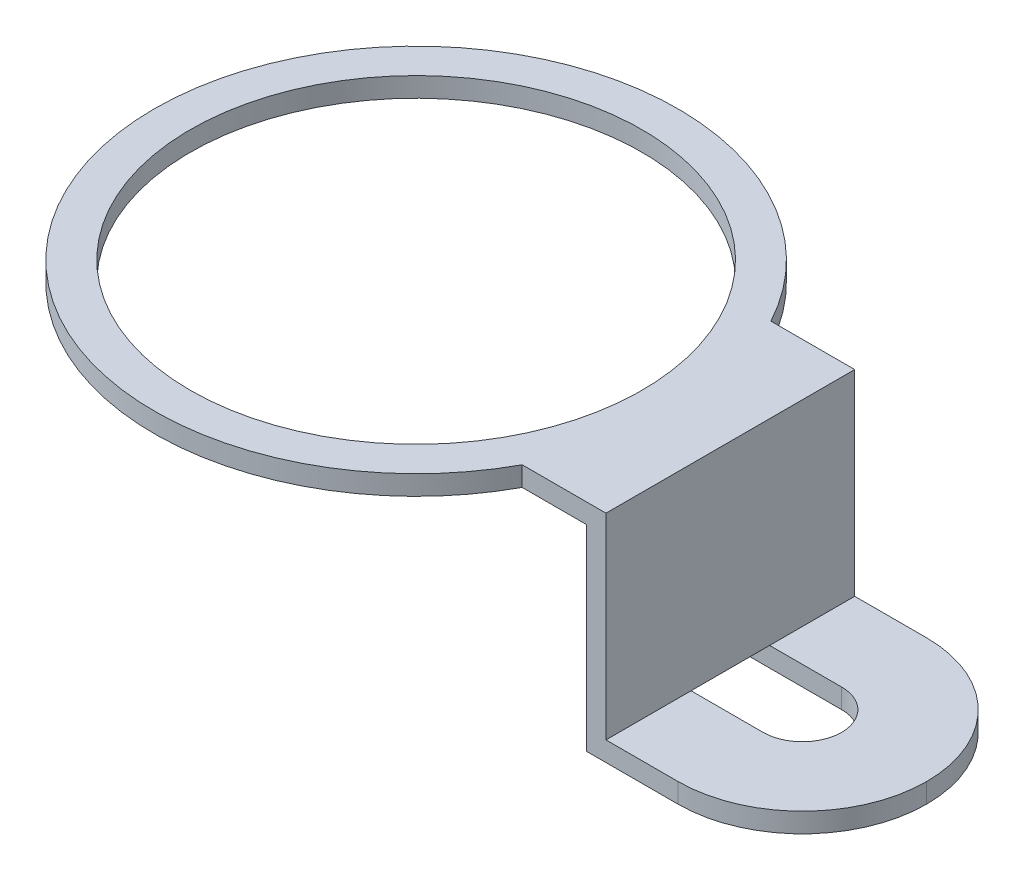
ISO-10303-21;
HEADER;
FILE_DESCRIPTION(('STEP AP214'),'2;1');
FILE_NAME('part.step','',(''),(''),'','','');
FILE_SCHEMA(('AUTOMOTIVE_DESIGN { 1 0 10303 214 1 1 1 1 }'));
ENDSEC;
DATA;
#1=APPLICATION_CONTEXT('core data for automotive mechanical design processes');
#2=APPLICATION_PROTOCOL_DEFINITION('international standard','automotive_design',2000,#1);
#3=PRODUCT_CONTEXT('',#1,'mechanical');
#4=PRODUCT('Part','Part','',(#3));
#5=PRODUCT_RELATED_PRODUCT_CATEGORY('part','',(#4));
#6=PRODUCT_DEFINITION_FORMATION('','',#4);
#7=PRODUCT_DEFINITION_CONTEXT('part definition',#1,'design');
#8=PRODUCT_DEFINITION('design','',#6,#7);
#9=PRODUCT_DEFINITION_SHAPE('','',#8);
#10=(LENGTH_UNIT() NAMED_UNIT(*) SI_UNIT(.MILLI.,.METRE.));
#11=(NAMED_UNIT(*) PLANE_ANGLE_UNIT() SI_UNIT($,.RADIAN.));
#12=(NAMED_UNIT(*) SI_UNIT($,.STERADIAN.) SOLID_ANGLE_UNIT());
#13=UNCERTAINTY_MEASURE_WITH_UNIT(LENGTH_MEASURE(1.E-05),#10,'distance_accuracy_value','');
#14=(GEOMETRIC_REPRESENTATION_CONTEXT(3) GLOBAL_UNCERTAINTY_ASSIGNED_CONTEXT((#13)) GLOBAL_UNIT_ASSIGNED_CONTEXT((#10,
#11,#12)) REPRESENTATION_CONTEXT('',''));
#15=CARTESIAN_POINT('',(0.,0.,0.));
#16=DIRECTION('',(0.,0.,1.));
#17=DIRECTION('',(1.,0.,0.));
#18=AXIS2_PLACEMENT_3D('',#15,#16,#17);
#19=CARTESIAN_POINT('',(10.,0.3,0.));
#20=DIRECTION('',(0.,-1.,0.));
#21=DIRECTION('',(0.,0.,-1.));
#22=AXIS2_PLACEMENT_3D('',#19,#20,#21);
#23=PLANE('',#22);
#24=CARTESIAN_POINT('',(0.,0.3,0.));
#25=DIRECTION('',(0.,1.,0.));
#26=DIRECTION('',(0.,0.,1.));
#27=AXIS2_PLACEMENT_3D('',#24,#25,#26);
#28=CIRCLE('',#27,3.45);
#29=CARTESIAN_POINT('',(0.,0.3,3.45));
#30=VERTEX_POINT('',#29);
#31=EDGE_CURVE('E187',#30,#30,#28,.T.);
#32=ORIENTED_EDGE('',*,*,#31,.F.);
#33=EDGE_LOOP('',(#32));
#34=FACE_BOUND('',#33,.T.);
#35=DIRECTION('',(1.,0.,0.));
#36=VECTOR('',#35,1.);
#37=CARTESIAN_POINT('',(3.51994318135961,0.3,1.9));
#38=LINE('',#37,#36);
#39=CARTESIAN_POINT('',(3.51994318135961,0.3,1.9));
#40=VERTEX_POINT('',#39);
#41=CARTESIAN_POINT('',(4.8,0.3,1.9));
#42=VERTEX_POINT('',#41);
#43=EDGE_CURVE('E290',#40,#42,#38,.T.);
#44=ORIENTED_EDGE('',*,*,#43,.T.);
#45=DIRECTION('',(0.,0.,1.));
#46=VECTOR('',#45,1.);
#47=CARTESIAN_POINT('',(4.8,0.3,-6.56690475583121));
#48=LINE('',#47,#46);
#49=CARTESIAN_POINT('',(4.8,0.3,-1.9));
#50=VERTEX_POINT('',#49);
#51=EDGE_CURVE('E169',#50,#42,#48,.T.);
#52=ORIENTED_EDGE('',*,*,#51,.F.);
#53=DIRECTION('',(-1.,0.,0.));
#54=VECTOR('',#53,1.);
#55=CARTESIAN_POINT('',(3.51994318135961,0.3,-1.9));
#56=LINE('',#55,#54);
#57=CARTESIAN_POINT('',(3.51994318135961,0.3,-1.9));
#58=VERTEX_POINT('',#57);
#59=EDGE_CURVE('E200',#50,#58,#56,.T.);
#60=ORIENTED_EDGE('',*,*,#59,.T.);
#61=CARTESIAN_POINT('',(0.,0.3,0.));
#62=DIRECTION('',(0.,1.,0.));
#63=DIRECTION('',(0.,0.,-1.));
#64=AXIS2_PLACEMENT_3D('',#61,#62,#63);
#65=CIRCLE('',#64,4.);
#66=EDGE_CURVE('E295',#58,#40,#65,.T.);
#67=ORIENTED_EDGE('',*,*,#66,.T.);
#68=EDGE_LOOP('',(#44,#52,#60,#67));
#69=FACE_BOUND('',#68,.T.);
#70=ADVANCED_FACE('F35',(#34,#69),#23,.F.);
#71=CARTESIAN_POINT('',(10.,0.,0.));
#72=DIRECTION('',(0.,-1.,0.));
#73=DIRECTION('',(0.,0.,-1.));
#74=AXIS2_PLACEMENT_3D('',#71,#72,#73);
#75=PLANE('',#74);
#76=DIRECTION('',(0.,0.,-1.));
#77=VECTOR('',#76,1.);
#78=CARTESIAN_POINT('',(4.5,0.,0.));
#79=LINE('',#78,#77);
#80=CARTESIAN_POINT('',(4.5,0.,1.9));
#81=VERTEX_POINT('',#80);
#82=CARTESIAN_POINT('',(4.5,0.,-1.9));
#83=VERTEX_POINT('',#82);
#84=EDGE_CURVE('E190',#81,#83,#79,.T.);
#85=ORIENTED_EDGE('',*,*,#84,.F.);
#86=DIRECTION('',(1.,0.,0.));
#87=VECTOR('',#86,1.);
#88=CARTESIAN_POINT('',(3.51994318135961,0.,1.9));
#89=LINE('',#88,#87);
#90=CARTESIAN_POINT('',(3.51994318135961,0.,1.9));
#91=VERTEX_POINT('',#90);
#92=EDGE_CURVE('E197',#91,#81,#89,.T.);
#93=ORIENTED_EDGE('',*,*,#92,.F.);
#94=CARTESIAN_POINT('',(0.,0.,0.));
#95=DIRECTION('',(0.,1.,0.));
#96=DIRECTION('',(0.,0.,-1.));
#97=AXIS2_PLACEMENT_3D('',#94,#95,#96);
#98=CIRCLE('',#97,4.);
#99=CARTESIAN_POINT('',(3.51994318135961,0.,-1.9));
#100=VERTEX_POINT('',#99);
#101=EDGE_CURVE('E201',#100,#91,#98,.T.);
#102=ORIENTED_EDGE('',*,*,#101,.F.);
#103=DIRECTION('',(-1.,0.,0.));
#104=VECTOR('',#103,1.);
#105=CARTESIAN_POINT('',(3.51994318135961,0.,-1.9));
#106=LINE('',#105,#104);
#107=EDGE_CURVE('E280',#83,#100,#106,.T.);
#108=ORIENTED_EDGE('',*,*,#107,.F.);
#109=EDGE_LOOP('',(#85,#93,#102,#108));
#110=FACE_BOUND('',#109,.T.);
#111=CARTESIAN_POINT('',(0.,0.,0.));
#112=DIRECTION('',(0.,1.,0.));
#113=DIRECTION('',(0.,0.,1.));
#114=AXIS2_PLACEMENT_3D('',#111,#112,#113);
#115=CIRCLE('',#114,3.45);
#116=CARTESIAN_POINT('',(0.,0.,3.45));
#117=VERTEX_POINT('',#116);
#118=EDGE_CURVE('E194',#117,#117,#115,.T.);
#119=ORIENTED_EDGE('',*,*,#118,.T.);
#120=EDGE_LOOP('',(#119));
#121=FACE_BOUND('',#120,.T.);
#122=ADVANCED_FACE('F284',(#110,#121),#75,.T.);
#123=CARTESIAN_POINT('',(3.51994318135961,0.3,-1.9));
#124=DIRECTION('',(0.,0.,1.));
#125=DIRECTION('',(1.,0.,0.));
#126=AXIS2_PLACEMENT_3D('',#123,#124,#125);
#127=PLANE('',#126);
#128=DIRECTION('',(1.,0.,0.));
#129=VECTOR('',#128,1.);
#130=CARTESIAN_POINT('',(4.8,-2.7,-1.9));
#131=LINE('',#130,#129);
#132=CARTESIAN_POINT('',(4.8,-2.7,-1.9));
#133=VERTEX_POINT('',#132);
#134=CARTESIAN_POINT('',(5.9,-2.7,-1.9));
#135=VERTEX_POINT('',#134);
#136=EDGE_CURVE('E168',#133,#135,#131,.T.);
#137=ORIENTED_EDGE('',*,*,#136,.T.);
#138=DIRECTION('',(0.,-1.,0.));
#139=VECTOR('',#138,1.);
#140=CARTESIAN_POINT('',(5.9,-3.,-1.9));
#141=LINE('',#140,#139);
#142=CARTESIAN_POINT('',(5.9,-3.,-1.9));
#143=VERTEX_POINT('',#142);
#144=EDGE_CURVE('E204',#135,#143,#141,.T.);
#145=ORIENTED_EDGE('',*,*,#144,.T.);
#146=DIRECTION('',(-1.,0.,0.));
#147=VECTOR('',#146,1.);
#148=CARTESIAN_POINT('',(4.5,-3.,-1.9));
#149=LINE('',#148,#147);
#150=CARTESIAN_POINT('',(4.5,-3.,-1.9));
#151=VERTEX_POINT('',#150);
#152=EDGE_CURVE('E166',#143,#151,#149,.T.);
#153=ORIENTED_EDGE('',*,*,#152,.T.);
#154=DIRECTION('',(0.,1.,0.));
#155=VECTOR('',#154,1.);
#156=CARTESIAN_POINT('',(4.5,0.,-1.9));
#157=LINE('',#156,#155);
#158=EDGE_CURVE('E174',#151,#83,#157,.T.);
#159=ORIENTED_EDGE('',*,*,#158,.T.);
#160=ORIENTED_EDGE('',*,*,#107,.T.);
#161=DIRECTION('',(0.,-1.,0.));
#162=VECTOR('',#161,1.);
#163=CARTESIAN_POINT('',(3.51994318135961,0.3,-1.9));
#164=LINE('',#163,#162);
#165=EDGE_CURVE('E208',#58,#100,#164,.T.);
#166=ORIENTED_EDGE('',*,*,#165,.F.);
#167=ORIENTED_EDGE('',*,*,#59,.F.);
#168=DIRECTION('',(0.,-1.,0.));
#169=VECTOR('',#168,1.);
#170=CARTESIAN_POINT('',(4.8,0.3,-1.9));
#171=LINE('',#170,#169);
#172=EDGE_CURVE('E172',#50,#133,#171,.T.);
#173=ORIENTED_EDGE('',*,*,#172,.T.);
#174=EDGE_LOOP('',(#137,#145,#153,#159,#160,#166,#167,#173));
#175=FACE_BOUND('',#174,.T.);
#176=ADVANCED_FACE('F274',(#175),#127,.F.);
#177=CARTESIAN_POINT('',(0.,0.3,0.));
#178=DIRECTION('',(0.,-1.,0.));
#179=DIRECTION('',(0.,0.,-1.));
#180=AXIS2_PLACEMENT_3D('',#177,#178,#179);
#181=CYLINDRICAL_SURFACE('',#180,4.);
#182=ORIENTED_EDGE('',*,*,#101,.T.);
#183=DIRECTION('',(0.,-1.,0.));
#184=VECTOR('',#183,1.);
#185=CARTESIAN_POINT('',(3.51994318135961,0.3,1.9));
#186=LINE('',#185,#184);
#187=EDGE_CURVE('E289',#40,#91,#186,.T.);
#188=ORIENTED_EDGE('',*,*,#187,.F.);
#189=ORIENTED_EDGE('',*,*,#66,.F.);
#190=ORIENTED_EDGE('',*,*,#165,.T.);
#191=EDGE_LOOP('',(#182,#188,#189,#190));
#192=FACE_BOUND('',#191,.T.);
#193=ADVANCED_FACE('F307',(#192),#181,.T.);
#194=CARTESIAN_POINT('',(3.51994318135961,0.3,1.9));
#195=DIRECTION('',(0.,0.,-1.));
#196=DIRECTION('',(-1.,0.,0.));
#197=AXIS2_PLACEMENT_3D('',#194,#195,#196);
#198=PLANE('',#197);
#199=DIRECTION('',(1.,0.,0.));
#200=VECTOR('',#199,1.);
#201=CARTESIAN_POINT('',(4.5,-3.,1.9));
#202=LINE('',#201,#200);
#203=CARTESIAN_POINT('',(4.5,-3.,1.9));
#204=VERTEX_POINT('',#203);
#205=CARTESIAN_POINT('',(5.9,-3.,1.9));
#206=VERTEX_POINT('',#205);
#207=EDGE_CURVE('E177',#204,#206,#202,.T.);
#208=ORIENTED_EDGE('',*,*,#207,.T.);
#209=DIRECTION('',(0.,1.,0.));
#210=VECTOR('',#209,1.);
#211=CARTESIAN_POINT('',(5.9,-2.7,1.9));
#212=LINE('',#211,#210);
#213=CARTESIAN_POINT('',(5.9,-2.7,1.9));
#214=VERTEX_POINT('',#213);
#215=EDGE_CURVE('E216',#206,#214,#212,.T.);
#216=ORIENTED_EDGE('',*,*,#215,.T.);
#217=DIRECTION('',(-1.,0.,0.));
#218=VECTOR('',#217,1.);
#219=CARTESIAN_POINT('',(4.8,-2.7,1.9));
#220=LINE('',#219,#218);
#221=CARTESIAN_POINT('',(4.8,-2.7,1.9));
#222=VERTEX_POINT('',#221);
#223=EDGE_CURVE('E256',#214,#222,#220,.T.);
#224=ORIENTED_EDGE('',*,*,#223,.T.);
#225=DIRECTION('',(0.,1.,0.));
#226=VECTOR('',#225,1.);
#227=CARTESIAN_POINT('',(4.8,0.3,1.9));
#228=LINE('',#227,#226);
#229=EDGE_CURVE('E253',#222,#42,#228,.T.);
#230=ORIENTED_EDGE('',*,*,#229,.T.);
#231=ORIENTED_EDGE('',*,*,#43,.F.);
#232=ORIENTED_EDGE('',*,*,#187,.T.);
#233=ORIENTED_EDGE('',*,*,#92,.T.);
#234=DIRECTION('',(0.,-1.,0.));
#235=VECTOR('',#234,1.);
#236=CARTESIAN_POINT('',(4.5,0.,1.9));
#237=LINE('',#236,#235);
#238=EDGE_CURVE('E180',#81,#204,#237,.T.);
#239=ORIENTED_EDGE('',*,*,#238,.T.);
#240=EDGE_LOOP('',(#208,#216,#224,#230,#231,#232,#233,#239));
#241=FACE_BOUND('',#240,.T.);
#242=ADVANCED_FACE('F264',(#241),#198,.F.);
#243=CARTESIAN_POINT('',(0.,0.3,0.));
#244=DIRECTION('',(0.,-1.,0.));
#245=DIRECTION('',(0.,0.,-1.));
#246=AXIS2_PLACEMENT_3D('',#243,#244,#245);
#247=CYLINDRICAL_SURFACE('',#246,3.45);
#248=ORIENTED_EDGE('',*,*,#31,.T.);
#249=EDGE_LOOP('',(#248));
#250=FACE_BOUND('',#249,.T.);
#251=ORIENTED_EDGE('',*,*,#118,.F.);
#252=EDGE_LOOP('',(#251));
#253=FACE_BOUND('',#252,.T.);
#254=ADVANCED_FACE('F315',(#250,#253),#247,.F.);
#255=CARTESIAN_POINT('',(4.8,0.3,-6.56690475583121));
#256=DIRECTION('',(1.,0.,0.));
#257=DIRECTION('',(0.,0.,-1.));
#258=AXIS2_PLACEMENT_3D('',#255,#256,#257);
#259=PLANE('',#258);
#260=ORIENTED_EDGE('',*,*,#172,.F.);
#261=ORIENTED_EDGE('',*,*,#51,.T.);
#262=ORIENTED_EDGE('',*,*,#229,.F.);
#263=DIRECTION('',(0.,0.,1.));
#264=VECTOR('',#263,1.);
#265=CARTESIAN_POINT('',(4.8,-2.7,-6.56690475583121));
#266=LINE('',#265,#264);
#267=CARTESIAN_POINT('',(4.8,-2.7,0.6));
#268=VERTEX_POINT('',#267);
#269=EDGE_CURVE('E241',#268,#222,#266,.T.);
#270=ORIENTED_EDGE('',*,*,#269,.F.);
#271=DIRECTION('',(0.,0.,1.));
#272=VECTOR('',#271,1.);
#273=CARTESIAN_POINT('',(4.8,-2.7,-6.56690475583121));
#274=LINE('',#273,#272);
#275=CARTESIAN_POINT('',(4.8,-2.7,-0.6));
#276=VERTEX_POINT('',#275);
#277=EDGE_CURVE('E140',#276,#268,#274,.T.);
#278=ORIENTED_EDGE('',*,*,#277,.F.);
#279=EDGE_CURVE('E239',#133,#276,#266,.T.);
#280=ORIENTED_EDGE('',*,*,#279,.F.);
#281=EDGE_LOOP('',(#260,#261,#262,#270,#278,#280));
#282=FACE_BOUND('',#281,.T.);
#283=ADVANCED_FACE('F238',(#282),#259,.T.);
#284=CARTESIAN_POINT('',(4.8,-2.7,-6.56690475583121));
#285=DIRECTION('',(0.,1.,0.));
#286=DIRECTION('',(-1.,0.,0.));
#287=AXIS2_PLACEMENT_3D('',#284,#285,#286);
#288=PLANE('',#287);
#289=DIRECTION('',(1.,0.,0.));
#290=VECTOR('',#289,1.);
#291=CARTESIAN_POINT('',(5.9,-2.7,0.6));
#292=LINE('',#291,#290);
#293=CARTESIAN_POINT('',(5.9,-2.7,0.6));
#294=VERTEX_POINT('',#293);
#295=EDGE_CURVE('E144',#268,#294,#292,.T.);
#296=ORIENTED_EDGE('',*,*,#295,.F.);
#297=ORIENTED_EDGE('',*,*,#269,.T.);
#298=ORIENTED_EDGE('',*,*,#223,.F.);
#299=CARTESIAN_POINT('',(5.9,-2.7,0.));
#300=DIRECTION('',(0.,1.,0.));
#301=DIRECTION('',(-1.,0.,0.));
#302=AXIS2_PLACEMENT_3D('',#299,#300,#301);
#303=CIRCLE('',#302,1.9);
#304=CARTESIAN_POINT('',(7.8,-2.7,0.));
#305=VERTEX_POINT('',#304);
#306=EDGE_CURVE('E212',#214,#305,#303,.T.);
#307=ORIENTED_EDGE('',*,*,#306,.T.);
#308=CARTESIAN_POINT('',(5.9,-2.7,0.));
#309=DIRECTION('',(0.,1.,0.));
#310=DIRECTION('',(-1.,0.,0.));
#311=AXIS2_PLACEMENT_3D('',#308,#309,#310);
#312=CIRCLE('',#311,1.9);
#313=EDGE_CURVE('E214',#305,#135,#312,.T.);
#314=ORIENTED_EDGE('',*,*,#313,.T.);
#315=ORIENTED_EDGE('',*,*,#136,.F.);
#316=ORIENTED_EDGE('',*,*,#279,.T.);
#317=DIRECTION('',(-1.,0.,0.));
#318=VECTOR('',#317,1.);
#319=CARTESIAN_POINT('',(5.9,-2.7,-0.6));
#320=LINE('',#319,#318);
#321=CARTESIAN_POINT('',(5.9,-2.7,-0.6));
#322=VERTEX_POINT('',#321);
#323=EDGE_CURVE('E148',#322,#276,#320,.T.);
#324=ORIENTED_EDGE('',*,*,#323,.F.);
#325=CARTESIAN_POINT('',(5.9,-2.7,0.));
#326=DIRECTION('',(0.,1.,0.));
#327=DIRECTION('',(-1.,0.,0.));
#328=AXIS2_PLACEMENT_3D('',#325,#326,#327);
#329=CIRCLE('',#328,0.6);
#330=EDGE_CURVE('E50',#294,#322,#329,.T.);
#331=ORIENTED_EDGE('',*,*,#330,.F.);
#332=EDGE_LOOP('',(#296,#297,#298,#307,#314,#315,#316,#324,#331));
#333=FACE_BOUND('',#332,.T.);
#334=ADVANCED_FACE('F151',(#333),#288,.T.);
#335=CARTESIAN_POINT('',(4.5,-3.,-6.56690475583121));
#336=DIRECTION('',(0.,-1.,0.));
#337=DIRECTION('',(0.,0.,-1.));
#338=AXIS2_PLACEMENT_3D('',#335,#336,#337);
#339=PLANE('',#338);
#340=DIRECTION('',(-1.,0.,0.));
#341=VECTOR('',#340,1.);
#342=CARTESIAN_POINT('',(4.5,-3.,0.6));
#343=LINE('',#342,#341);
#344=CARTESIAN_POINT('',(5.9,-3.,0.6));
#345=VERTEX_POINT('',#344);
#346=CARTESIAN_POINT('',(4.5,-3.,0.6));
#347=VERTEX_POINT('',#346);
#348=EDGE_CURVE('E163',#345,#347,#343,.T.);
#349=ORIENTED_EDGE('',*,*,#348,.F.);
#350=CARTESIAN_POINT('',(5.9,-3.,0.));
#351=DIRECTION('',(0.,-1.,0.));
#352=DIRECTION('',(0.,0.,-1.));
#353=AXIS2_PLACEMENT_3D('',#350,#351,#352);
#354=CIRCLE('',#353,0.6);
#355=CARTESIAN_POINT('',(5.9,-3.,-0.6));
#356=VERTEX_POINT('',#355);
#357=EDGE_CURVE('E11',#356,#345,#354,.T.);
#358=ORIENTED_EDGE('',*,*,#357,.F.);
#359=DIRECTION('',(1.,0.,0.));
#360=VECTOR('',#359,1.);
#361=CARTESIAN_POINT('',(4.5,-3.,-0.6));
#362=LINE('',#361,#360);
#363=CARTESIAN_POINT('',(4.5,-3.,-0.6));
#364=VERTEX_POINT('',#363);
#365=EDGE_CURVE('E161',#364,#356,#362,.T.);
#366=ORIENTED_EDGE('',*,*,#365,.F.);
#367=DIRECTION('',(0.,0.,1.));
#368=VECTOR('',#367,1.);
#369=CARTESIAN_POINT('',(4.5,-3.,-6.56690475583121));
#370=LINE('',#369,#368);
#371=EDGE_CURVE('E246',#151,#364,#370,.T.);
#372=ORIENTED_EDGE('',*,*,#371,.F.);
#373=ORIENTED_EDGE('',*,*,#152,.F.);
#374=CARTESIAN_POINT('',(5.9,-3.,0.));
#375=DIRECTION('',(0.,-1.,0.));
#376=DIRECTION('',(0.,0.,-1.));
#377=AXIS2_PLACEMENT_3D('',#374,#375,#376);
#378=CIRCLE('',#377,1.9);
#379=CARTESIAN_POINT('',(7.8,-3.,0.));
#380=VERTEX_POINT('',#379);
#381=EDGE_CURVE('E210',#143,#380,#378,.T.);
#382=ORIENTED_EDGE('',*,*,#381,.T.);
#383=CARTESIAN_POINT('',(5.9,-3.,0.));
#384=DIRECTION('',(0.,-1.,0.));
#385=DIRECTION('',(0.,0.,-1.));
#386=AXIS2_PLACEMENT_3D('',#383,#384,#385);
#387=CIRCLE('',#386,1.9);
#388=EDGE_CURVE('E207',#380,#206,#387,.T.);
#389=ORIENTED_EDGE('',*,*,#388,.T.);
#390=ORIENTED_EDGE('',*,*,#207,.F.);
#391=EDGE_CURVE('E249',#347,#204,#370,.T.);
#392=ORIENTED_EDGE('',*,*,#391,.F.);
#393=EDGE_LOOP('',(#349,#358,#366,#372,#373,#382,#389,#390,#392));
#394=FACE_BOUND('',#393,.T.);
#395=ADVANCED_FACE('F277',(#394),#339,.T.);
#396=CARTESIAN_POINT('',(4.5,0.,-6.56690475583121));
#397=DIRECTION('',(-1.,0.,0.));
#398=DIRECTION('',(0.,-1.,0.));
#399=AXIS2_PLACEMENT_3D('',#396,#397,#398);
#400=PLANE('',#399);
#401=DIRECTION('',(0.,1.,0.));
#402=VECTOR('',#401,1.);
#403=CARTESIAN_POINT('',(4.5,0.,0.6));
#404=LINE('',#403,#402);
#405=CARTESIAN_POINT('',(4.5,-2.7,0.600000000000001));
#406=VERTEX_POINT('',#405);
#407=EDGE_CURVE('E43',#347,#406,#404,.T.);
#408=ORIENTED_EDGE('',*,*,#407,.F.);
#409=ORIENTED_EDGE('',*,*,#391,.T.);
#410=ORIENTED_EDGE('',*,*,#238,.F.);
#411=ORIENTED_EDGE('',*,*,#84,.T.);
#412=ORIENTED_EDGE('',*,*,#158,.F.);
#413=ORIENTED_EDGE('',*,*,#371,.T.);
#414=DIRECTION('',(0.,-1.,0.));
#415=VECTOR('',#414,1.);
#416=CARTESIAN_POINT('',(4.5,0.,-0.6));
#417=LINE('',#416,#415);
#418=CARTESIAN_POINT('',(4.5,-2.7,-0.6));
#419=VERTEX_POINT('',#418);
#420=EDGE_CURVE('E222',#419,#364,#417,.T.);
#421=ORIENTED_EDGE('',*,*,#420,.F.);
#422=DIRECTION('',(0.,0.,-1.));
#423=VECTOR('',#422,1.);
#424=CARTESIAN_POINT('',(4.5,-2.7,-6.56690475583121));
#425=LINE('',#424,#423);
#426=EDGE_CURVE('E218',#406,#419,#425,.T.);
#427=ORIENTED_EDGE('',*,*,#426,.F.);
#428=EDGE_LOOP('',(#408,#409,#410,#411,#412,#413,#421,#427));
#429=FACE_BOUND('',#428,.T.);
#430=ADVANCED_FACE('F228',(#429),#400,.T.);
#431=CARTESIAN_POINT('',(5.9,0.3,0.));
#432=DIRECTION('',(0.,-1.,0.));
#433=DIRECTION('',(0.,0.,-1.));
#434=AXIS2_PLACEMENT_3D('',#431,#432,#433);
#435=CYLINDRICAL_SURFACE('',#434,1.9);
#436=DIRECTION('',(0.,1.,0.));
#437=VECTOR('',#436,1.);
#438=CARTESIAN_POINT('',(7.8,-3.,0.));
#439=LINE('',#438,#437);
#440=EDGE_CURVE('E165',#305,#380,#439,.F.);
#441=ORIENTED_EDGE('',*,*,#440,.F.);
#442=ORIENTED_EDGE('',*,*,#306,.F.);
#443=ORIENTED_EDGE('',*,*,#215,.F.);
#444=ORIENTED_EDGE('',*,*,#388,.F.);
#445=EDGE_LOOP('',(#441,#442,#443,#444));
#446=FACE_BOUND('',#445,.T.);
#447=ADVANCED_FACE('F37',(#446),#435,.T.);
#448=CARTESIAN_POINT('',(5.9,0.3,0.));
#449=DIRECTION('',(0.,1.,0.));
#450=DIRECTION('',(0.,0.,1.));
#451=AXIS2_PLACEMENT_3D('',#448,#449,#450);
#452=CYLINDRICAL_SURFACE('',#451,1.9);
#453=ORIENTED_EDGE('',*,*,#313,.F.);
#454=ORIENTED_EDGE('',*,*,#440,.T.);
#455=ORIENTED_EDGE('',*,*,#381,.F.);
#456=ORIENTED_EDGE('',*,*,#144,.F.);
#457=EDGE_LOOP('',(#453,#454,#455,#456));
#458=FACE_BOUND('',#457,.T.);
#459=ADVANCED_FACE('F276',(#458),#452,.T.);
#460=CARTESIAN_POINT('',(5.9,-12.7,0.));
#461=DIRECTION('',(0.,1.,0.));
#462=DIRECTION('',(-1.,0.,0.));
#463=AXIS2_PLACEMENT_3D('',#460,#461,#462);
#464=CYLINDRICAL_SURFACE('',#463,0.6);
#465=ORIENTED_EDGE('',*,*,#357,.T.);
#466=DIRECTION('',(0.,1.,0.));
#467=VECTOR('',#466,1.);
#468=CARTESIAN_POINT('',(5.9,-12.7,0.6));
#469=LINE('',#468,#467);
#470=EDGE_CURVE('E134',#345,#294,#469,.T.);
#471=ORIENTED_EDGE('',*,*,#470,.T.);
#472=ORIENTED_EDGE('',*,*,#330,.T.);
#473=DIRECTION('',(0.,1.,0.));
#474=VECTOR('',#473,1.);
#475=CARTESIAN_POINT('',(5.9,-12.7,-0.6));
#476=LINE('',#475,#474);
#477=EDGE_CURVE('E141',#356,#322,#476,.T.);
#478=ORIENTED_EDGE('',*,*,#477,.F.);
#479=EDGE_LOOP('',(#465,#471,#472,#478));
#480=FACE_BOUND('',#479,.T.);
#481=ADVANCED_FACE('F136',(#480),#464,.F.);
#482=CARTESIAN_POINT('',(5.9,-12.7,0.6));
#483=DIRECTION('',(0.,0.,1.));
#484=DIRECTION('',(1.,0.,0.));
#485=AXIS2_PLACEMENT_3D('',#482,#483,#484);
#486=PLANE('',#485);
#487=ORIENTED_EDGE('',*,*,#348,.T.);
#488=ORIENTED_EDGE('',*,*,#407,.T.);
#489=EDGE_CURVE('E58',#406,#268,#292,.T.);
#490=ORIENTED_EDGE('',*,*,#489,.T.);
#491=ORIENTED_EDGE('',*,*,#295,.T.);
#492=ORIENTED_EDGE('',*,*,#470,.F.);
#493=EDGE_LOOP('',(#487,#488,#490,#491,#492));
#494=FACE_BOUND('',#493,.T.);
#495=ADVANCED_FACE('F145',(#494),#486,.F.);
#496=CARTESIAN_POINT('',(5.9,-12.7,-0.6));
#497=DIRECTION('',(0.,0.,-1.));
#498=DIRECTION('',(-1.,0.,0.));
#499=AXIS2_PLACEMENT_3D('',#496,#497,#498);
#500=PLANE('',#499);
#501=ORIENTED_EDGE('',*,*,#365,.T.);
#502=ORIENTED_EDGE('',*,*,#477,.T.);
#503=ORIENTED_EDGE('',*,*,#323,.T.);
#504=EDGE_CURVE('E154',#276,#419,#320,.T.);
#505=ORIENTED_EDGE('',*,*,#504,.T.);
#506=ORIENTED_EDGE('',*,*,#420,.T.);
#507=EDGE_LOOP('',(#501,#502,#503,#505,#506));
#508=FACE_BOUND('',#507,.T.);
#509=ADVANCED_FACE('F232',(#508),#500,.F.);
#510=CARTESIAN_POINT('',(5.9,-2.7,0.));
#511=DIRECTION('',(0.,1.,0.));
#512=DIRECTION('',(-1.,0.,0.));
#513=AXIS2_PLACEMENT_3D('',#510,#511,#512);
#514=PLANE('',#513);
#515=ORIENTED_EDGE('',*,*,#277,.T.);
#516=ORIENTED_EDGE('',*,*,#489,.F.);
#517=ORIENTED_EDGE('',*,*,#426,.T.);
#518=ORIENTED_EDGE('',*,*,#504,.F.);
#519=EDGE_LOOP('',(#515,#516,#517,#518));
#520=FACE_BOUND('',#519,.T.);
#521=ADVANCED_FACE('F230',(#520),#514,.F.);
#522=CLOSED_SHELL('',(#70,#122,#176,#193,#242,#254,#283,#334,#395,#430,#447,#459,#481,#495,#509,#521));
#523=MANIFOLD_SOLID_BREP('B2',#522);
#524=ADVANCED_BREP_SHAPE_REPRESENTATION('',(#18,#523),#14);
#525=SHAPE_DEFINITION_REPRESENTATION(#9,#524);
ENDSEC;
END-ISO-10303-21;
